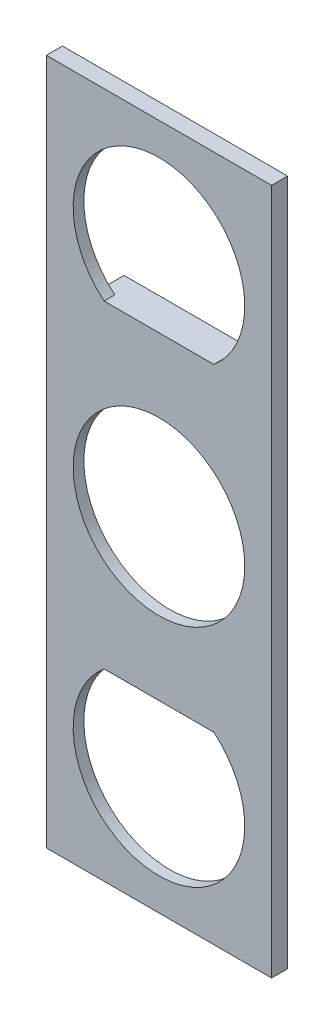
ISO-10303-21;
HEADER;
FILE_DESCRIPTION(('STEP AP214'),'2;1');
FILE_NAME('part.step','',(''),(''),'','','');
FILE_SCHEMA(('AUTOMOTIVE_DESIGN { 1 0 10303 214 1 1 1 1 }'));
ENDSEC;
DATA;
#1=APPLICATION_CONTEXT('core data for automotive mechanical design processes');
#2=APPLICATION_PROTOCOL_DEFINITION('international standard','automotive_design',2000,#1);
#3=PRODUCT_CONTEXT('',#1,'mechanical');
#4=PRODUCT('Part','Part','',(#3));
#5=PRODUCT_RELATED_PRODUCT_CATEGORY('part','',(#4));
#6=PRODUCT_DEFINITION_FORMATION('','',#4);
#7=PRODUCT_DEFINITION_CONTEXT('part definition',#1,'design');
#8=PRODUCT_DEFINITION('design','',#6,#7);
#9=PRODUCT_DEFINITION_SHAPE('','',#8);
#10=(LENGTH_UNIT() NAMED_UNIT(*) SI_UNIT(.MILLI.,.METRE.));
#11=(NAMED_UNIT(*) PLANE_ANGLE_UNIT() SI_UNIT($,.RADIAN.));
#12=(NAMED_UNIT(*) SI_UNIT($,.STERADIAN.) SOLID_ANGLE_UNIT());
#13=UNCERTAINTY_MEASURE_WITH_UNIT(LENGTH_MEASURE(1.E-05),#10,'distance_accuracy_value','');
#14=(GEOMETRIC_REPRESENTATION_CONTEXT(3) GLOBAL_UNCERTAINTY_ASSIGNED_CONTEXT((#13)) GLOBAL_UNIT_ASSIGNED_CONTEXT((#10,
#11,#12)) REPRESENTATION_CONTEXT('',''));
#15=CARTESIAN_POINT('',(0.,0.,0.));
#16=DIRECTION('',(0.,0.,1.));
#17=DIRECTION('',(1.,0.,0.));
#18=AXIS2_PLACEMENT_3D('',#15,#16,#17);
#19=CARTESIAN_POINT('',(-12.4999999999572,29.6984848098497,6.));
#20=DIRECTION('',(1.,0.,0.));
#21=DIRECTION('',(0.,0.,-1.));
#22=AXIS2_PLACEMENT_3D('',#19,#20,#21);
#23=PLANE('',#22);
#24=DIRECTION('',(0.,-1.,0.));
#25=VECTOR('',#24,1.);
#26=CARTESIAN_POINT('',(-12.4999999999572,29.6984848098497,4.));
#27=LINE('',#26,#25);
#28=CARTESIAN_POINT('',(-12.4999999999572,29.6984848098497,4.));
#29=VERTEX_POINT('',#28);
#30=CARTESIAN_POINT('',(-12.4999999999572,24.6984848098497,4.));
#31=VERTEX_POINT('',#30);
#32=EDGE_CURVE('E305',#29,#31,#27,.T.);
#33=ORIENTED_EDGE('',*,*,#32,.F.);
#34=DIRECTION('',(0.,0.,-1.));
#35=VECTOR('',#34,1.);
#36=CARTESIAN_POINT('',(-12.4999999999572,29.6984848098497,6.));
#37=LINE('',#36,#35);
#38=CARTESIAN_POINT('',(-12.4999999999572,29.6984848098497,0.));
#39=VERTEX_POINT('',#38);
#40=EDGE_CURVE('E49',#29,#39,#37,.T.);
#41=ORIENTED_EDGE('',*,*,#40,.T.);
#42=DIRECTION('',(0.,-1.,0.));
#43=VECTOR('',#42,1.);
#44=CARTESIAN_POINT('',(-12.4999999999572,29.6984848098497,0.));
#45=LINE('',#44,#43);
#46=CARTESIAN_POINT('',(-12.4999999999572,24.6984848098497,0.));
#47=VERTEX_POINT('',#46);
#48=EDGE_CURVE('E311',#39,#47,#45,.T.);
#49=ORIENTED_EDGE('',*,*,#48,.T.);
#50=DIRECTION('',(0.,0.,-1.));
#51=VECTOR('',#50,1.);
#52=CARTESIAN_POINT('',(-12.4999999999572,24.6984848098497,6.));
#53=LINE('',#52,#51);
#54=EDGE_CURVE('E326',#31,#47,#53,.T.);
#55=ORIENTED_EDGE('',*,*,#54,.F.);
#56=EDGE_LOOP('',(#33,#41,#49,#55));
#57=FACE_BOUND('',#56,.T.);
#58=ADVANCED_FACE('F35',(#57),#23,.F.);
#59=CARTESIAN_POINT('',(-12.4999999999572,24.6984848098497,6.));
#60=DIRECTION('',(0.,1.,0.));
#61=DIRECTION('',(0.,0.,1.));
#62=AXIS2_PLACEMENT_3D('',#59,#60,#61);
#63=PLANE('',#62);
#64=DIRECTION('',(1.,0.,0.));
#65=VECTOR('',#64,1.);
#66=CARTESIAN_POINT('',(-12.4999999999572,24.6984848098497,4.));
#67=LINE('',#66,#65);
#68=CARTESIAN_POINT('',(12.5000000000427,24.6984848098497,4.));
#69=VERTEX_POINT('',#68);
#70=EDGE_CURVE('E307',#31,#69,#67,.T.);
#71=ORIENTED_EDGE('',*,*,#70,.F.);
#72=ORIENTED_EDGE('',*,*,#54,.T.);
#73=DIRECTION('',(1.,0.,0.));
#74=VECTOR('',#73,1.);
#75=CARTESIAN_POINT('',(-12.4999999999572,24.6984848098497,0.));
#76=LINE('',#75,#74);
#77=CARTESIAN_POINT('',(12.5000000000427,24.6984848098497,0.));
#78=VERTEX_POINT('',#77);
#79=EDGE_CURVE('E317',#47,#78,#76,.T.);
#80=ORIENTED_EDGE('',*,*,#79,.T.);
#81=DIRECTION('',(0.,0.,-1.));
#82=VECTOR('',#81,1.);
#83=CARTESIAN_POINT('',(12.5000000000427,24.6984848098497,6.));
#84=LINE('',#83,#82);
#85=EDGE_CURVE('E325',#69,#78,#84,.T.);
#86=ORIENTED_EDGE('',*,*,#85,.F.);
#87=EDGE_LOOP('',(#71,#72,#80,#86));
#88=FACE_BOUND('',#87,.T.);
#89=ADVANCED_FACE('F344',(#88),#63,.F.);
#90=CARTESIAN_POINT('',(12.5000000000427,29.6984848098497,6.));
#91=DIRECTION('',(-1.,0.,0.));
#92=DIRECTION('',(0.,0.,1.));
#93=AXIS2_PLACEMENT_3D('',#90,#91,#92);
#94=PLANE('',#93);
#95=DIRECTION('',(0.,1.,0.));
#96=VECTOR('',#95,1.);
#97=CARTESIAN_POINT('',(12.5000000000427,29.6984848098497,4.));
#98=LINE('',#97,#96);
#99=CARTESIAN_POINT('',(12.5000000000427,29.6984848098497,4.));
#100=VERTEX_POINT('',#99);
#101=EDGE_CURVE('E309',#69,#100,#98,.T.);
#102=ORIENTED_EDGE('',*,*,#101,.F.);
#103=ORIENTED_EDGE('',*,*,#85,.T.);
#104=DIRECTION('',(0.,1.,0.));
#105=VECTOR('',#104,1.);
#106=CARTESIAN_POINT('',(12.5000000000427,29.6984848098497,0.));
#107=LINE('',#106,#105);
#108=CARTESIAN_POINT('',(12.5000000000427,29.6984848098497,0.));
#109=VERTEX_POINT('',#108);
#110=EDGE_CURVE('E320',#78,#109,#107,.T.);
#111=ORIENTED_EDGE('',*,*,#110,.T.);
#112=DIRECTION('',(0.,0.,-1.));
#113=VECTOR('',#112,1.);
#114=CARTESIAN_POINT('',(12.5000000000427,29.6984848098497,6.));
#115=LINE('',#114,#113);
#116=EDGE_CURVE('E56',#100,#109,#115,.T.);
#117=ORIENTED_EDGE('',*,*,#116,.F.);
#118=EDGE_LOOP('',(#102,#103,#111,#117));
#119=FACE_BOUND('',#118,.T.);
#120=ADVANCED_FACE('F347',(#119),#94,.F.);
#121=CARTESIAN_POINT('',(-12.4999999999572,29.6984848098497,6.));
#122=DIRECTION('',(0.,-1.,0.));
#123=DIRECTION('',(0.,0.,-1.));
#124=AXIS2_PLACEMENT_3D('',#121,#122,#123);
#125=PLANE('',#124);
#126=DIRECTION('',(0.,0.,1.));
#127=VECTOR('',#126,1.);
#128=CARTESIAN_POINT('',(10.2309688703709,29.6984848098497,4.));
#129=LINE('',#128,#127);
#130=CARTESIAN_POINT('',(10.2309688703709,29.6984848098497,4.));
#131=VERTEX_POINT('',#130);
#132=CARTESIAN_POINT('',(10.2309688703709,29.6984848098497,6.));
#133=VERTEX_POINT('',#132);
#134=EDGE_CURVE('E303',#131,#133,#129,.T.);
#135=ORIENTED_EDGE('',*,*,#134,.F.);
#136=DIRECTION('',(-1.,0.,0.));
#137=VECTOR('',#136,1.);
#138=CARTESIAN_POINT('',(-12.4999999999572,29.6984848098497,4.));
#139=LINE('',#138,#137);
#140=EDGE_CURVE('E11',#100,#131,#139,.T.);
#141=ORIENTED_EDGE('',*,*,#140,.F.);
#142=ORIENTED_EDGE('',*,*,#116,.T.);
#143=DIRECTION('',(-1.,0.,0.));
#144=VECTOR('',#143,1.);
#145=CARTESIAN_POINT('',(-12.4999999999572,29.6984848098497,0.));
#146=LINE('',#145,#144);
#147=EDGE_CURVE('E315',#109,#39,#146,.T.);
#148=ORIENTED_EDGE('',*,*,#147,.T.);
#149=ORIENTED_EDGE('',*,*,#40,.F.);
#150=CARTESIAN_POINT('',(-10.2309688703712,29.6984848098497,4.));
#151=VERTEX_POINT('',#150);
#152=EDGE_CURVE('E38',#151,#29,#139,.T.);
#153=ORIENTED_EDGE('',*,*,#152,.F.);
#154=DIRECTION('',(0.,0.,1.));
#155=VECTOR('',#154,1.);
#156=CARTESIAN_POINT('',(-10.2309688703712,29.6984848098497,4.));
#157=LINE('',#156,#155);
#158=CARTESIAN_POINT('',(-10.2309688703712,29.6984848098497,6.));
#159=VERTEX_POINT('',#158);
#160=EDGE_CURVE('E299',#159,#151,#157,.F.);
#161=ORIENTED_EDGE('',*,*,#160,.F.);
#162=DIRECTION('',(-1.,0.,0.));
#163=VECTOR('',#162,1.);
#164=CARTESIAN_POINT('',(-12.4999999999572,29.6984848098497,6.));
#165=LINE('',#164,#163);
#166=EDGE_CURVE('E312',#133,#159,#165,.T.);
#167=ORIENTED_EDGE('',*,*,#166,.F.);
#168=EDGE_LOOP('',(#135,#141,#142,#148,#149,#153,#161,#167));
#169=FACE_BOUND('',#168,.T.);
#170=ADVANCED_FACE('F337',(#169),#125,.F.);
#171=CARTESIAN_POINT('',(0.,0.,6.));
#172=DIRECTION('',(0.,0.,1.));
#173=DIRECTION('',(1.,0.,0.));
#174=AXIS2_PLACEMENT_3D('',#171,#172,#173);
#175=PLANE('',#174);
#176=CARTESIAN_POINT('',(-1.47451495458029E-13,42.,6.));
#177=DIRECTION('',(0.,0.,1.));
#178=DIRECTION('',(1.,0.,0.));
#179=AXIS2_PLACEMENT_3D('',#176,#177,#178);
#180=CIRCLE('',#179,16.);
#181=EDGE_CURVE('E261',#133,#159,#180,.T.);
#182=ORIENTED_EDGE('',*,*,#181,.F.);
#183=ORIENTED_EDGE('',*,*,#166,.T.);
#184=EDGE_LOOP('',(#182,#183));
#185=FACE_BOUND('',#184,.T.);
#186=CARTESIAN_POINT('',(0.,0.,6.));
#187=DIRECTION('',(0.,0.,1.));
#188=DIRECTION('',(1.,0.,0.));
#189=AXIS2_PLACEMENT_3D('',#186,#187,#188);
#190=CIRCLE('',#189,16.);
#191=CARTESIAN_POINT('',(16.,0.,6.));
#192=VERTEX_POINT('',#191);
#193=EDGE_CURVE('E266',#192,#192,#190,.T.);
#194=ORIENTED_EDGE('',*,*,#193,.F.);
#195=EDGE_LOOP('',(#194));
#196=FACE_BOUND('',#195,.T.);
#197=CARTESIAN_POINT('',(4.40619762898109E-13,-42.,6.));
#198=DIRECTION('',(0.,0.,1.));
#199=DIRECTION('',(1.,0.,0.));
#200=AXIS2_PLACEMENT_3D('',#197,#198,#199);
#201=CIRCLE('',#200,16.);
#202=CARTESIAN_POINT('',(-10.2309688702872,-29.6984848097803,6.));
#203=VERTEX_POINT('',#202);
#204=CARTESIAN_POINT('',(10.2309688702881,-29.6984848097803,6.));
#205=VERTEX_POINT('',#204);
#206=EDGE_CURVE('E292',#203,#205,#201,.T.);
#207=ORIENTED_EDGE('',*,*,#206,.F.);
#208=DIRECTION('',(1.,0.,0.));
#209=VECTOR('',#208,1.);
#210=CARTESIAN_POINT('',(-12.4999999999536,-29.6984848097803,6.));
#211=LINE('',#210,#209);
#212=EDGE_CURVE('E239',#203,#205,#211,.T.);
#213=ORIENTED_EDGE('',*,*,#212,.T.);
#214=EDGE_LOOP('',(#207,#213));
#215=FACE_BOUND('',#214,.T.);
#216=DIRECTION('',(0.,-1.,0.));
#217=VECTOR('',#216,1.);
#218=CARTESIAN_POINT('',(20.9999999999999,0.,6.));
#219=LINE('',#218,#217);
#220=CARTESIAN_POINT('',(20.9999999999999,64.,6.));
#221=VERTEX_POINT('',#220);
#222=CARTESIAN_POINT('',(20.9999999999999,-64.,6.));
#223=VERTEX_POINT('',#222);
#224=EDGE_CURVE('E218',#221,#223,#219,.T.);
#225=ORIENTED_EDGE('',*,*,#224,.F.);
#226=DIRECTION('',(1.,0.,0.));
#227=VECTOR('',#226,1.);
#228=CARTESIAN_POINT('',(0.,64.,6.));
#229=LINE('',#228,#227);
#230=CARTESIAN_POINT('',(-21.0000000000001,64.,6.));
#231=VERTEX_POINT('',#230);
#232=EDGE_CURVE('E189',#231,#221,#229,.T.);
#233=ORIENTED_EDGE('',*,*,#232,.F.);
#234=DIRECTION('',(0.,-1.,0.));
#235=VECTOR('',#234,1.);
#236=CARTESIAN_POINT('',(-21.0000000000001,0.,6.));
#237=LINE('',#236,#235);
#238=CARTESIAN_POINT('',(-21.0000000000001,-64.,6.));
#239=VERTEX_POINT('',#238);
#240=EDGE_CURVE('E202',#231,#239,#237,.T.);
#241=ORIENTED_EDGE('',*,*,#240,.T.);
#242=DIRECTION('',(1.,0.,0.));
#243=VECTOR('',#242,1.);
#244=CARTESIAN_POINT('',(0.,-64.,6.));
#245=LINE('',#244,#243);
#246=EDGE_CURVE('E199',#239,#223,#245,.T.);
#247=ORIENTED_EDGE('',*,*,#246,.T.);
#248=EDGE_LOOP('',(#225,#233,#241,#247));
#249=FACE_BOUND('',#248,.T.);
#250=ADVANCED_FACE('F353',(#185,#196,#215,#249),#175,.T.);
#251=CARTESIAN_POINT('',(0.,0.,0.));
#252=DIRECTION('',(0.,0.,1.));
#253=DIRECTION('',(1.,0.,0.));
#254=AXIS2_PLACEMENT_3D('',#251,#252,#253);
#255=PLANE('',#254);
#256=ORIENTED_EDGE('',*,*,#48,.F.);
#257=ORIENTED_EDGE('',*,*,#147,.F.);
#258=ORIENTED_EDGE('',*,*,#110,.F.);
#259=ORIENTED_EDGE('',*,*,#79,.F.);
#260=EDGE_LOOP('',(#256,#257,#258,#259));
#261=FACE_BOUND('',#260,.T.);
#262=ADVANCED_FACE('F342',(#261),#255,.F.);
#263=CARTESIAN_POINT('',(0.,0.,4.));
#264=DIRECTION('',(0.,0.,1.));
#265=DIRECTION('',(1.,0.,0.));
#266=AXIS2_PLACEMENT_3D('',#263,#264,#265);
#267=PLANE('',#266);
#268=CARTESIAN_POINT('',(4.40619762898109E-13,-42.,4.));
#269=DIRECTION('',(0.,0.,1.));
#270=DIRECTION('',(1.,0.,0.));
#271=AXIS2_PLACEMENT_3D('',#268,#269,#270);
#272=CIRCLE('',#271,16.);
#273=CARTESIAN_POINT('',(-10.2309688702872,-29.6984848097803,4.));
#274=VERTEX_POINT('',#273);
#275=CARTESIAN_POINT('',(10.2309688702881,-29.6984848097803,4.));
#276=VERTEX_POINT('',#275);
#277=EDGE_CURVE('E265',#274,#276,#272,.T.);
#278=ORIENTED_EDGE('',*,*,#277,.T.);
#279=DIRECTION('',(1.,0.,0.));
#280=VECTOR('',#279,1.);
#281=CARTESIAN_POINT('',(0.,-29.6984848097803,4.));
#282=LINE('',#281,#280);
#283=CARTESIAN_POINT('',(12.5000000000463,-29.6984848097803,4.));
#284=VERTEX_POINT('',#283);
#285=EDGE_CURVE('E271',#276,#284,#282,.T.);
#286=ORIENTED_EDGE('',*,*,#285,.T.);
#287=DIRECTION('',(0.,1.,0.));
#288=VECTOR('',#287,1.);
#289=CARTESIAN_POINT('',(12.5000000000463,0.,4.));
#290=LINE('',#289,#288);
#291=CARTESIAN_POINT('',(12.5000000000463,-24.6984848097803,4.));
#292=VERTEX_POINT('',#291);
#293=EDGE_CURVE('E275',#284,#292,#290,.T.);
#294=ORIENTED_EDGE('',*,*,#293,.T.);
#295=DIRECTION('',(-1.,0.,0.));
#296=VECTOR('',#295,1.);
#297=CARTESIAN_POINT('',(0.,-24.6984848097803,4.));
#298=LINE('',#297,#296);
#299=CARTESIAN_POINT('',(-12.4999999999536,-24.6984848097803,4.));
#300=VERTEX_POINT('',#299);
#301=EDGE_CURVE('E273',#292,#300,#298,.T.);
#302=ORIENTED_EDGE('',*,*,#301,.T.);
#303=DIRECTION('',(0.,-1.,0.));
#304=VECTOR('',#303,1.);
#305=CARTESIAN_POINT('',(-12.4999999999536,0.,4.));
#306=LINE('',#305,#304);
#307=CARTESIAN_POINT('',(-12.4999999999536,-29.6984848097803,4.));
#308=VERTEX_POINT('',#307);
#309=EDGE_CURVE('E270',#300,#308,#306,.T.);
#310=ORIENTED_EDGE('',*,*,#309,.T.);
#311=EDGE_CURVE('E268',#308,#274,#282,.T.);
#312=ORIENTED_EDGE('',*,*,#311,.T.);
#313=EDGE_LOOP('',(#278,#286,#294,#302,#310,#312));
#314=FACE_BOUND('',#313,.T.);
#315=CARTESIAN_POINT('',(0.,0.,4.));
#316=DIRECTION('',(0.,0.,1.));
#317=DIRECTION('',(1.,0.,0.));
#318=AXIS2_PLACEMENT_3D('',#315,#316,#317);
#319=CIRCLE('',#318,16.);
#320=CARTESIAN_POINT('',(16.,0.,4.));
#321=VERTEX_POINT('',#320);
#322=EDGE_CURVE('E277',#321,#321,#319,.T.);
#323=ORIENTED_EDGE('',*,*,#322,.T.);
#324=EDGE_LOOP('',(#323));
#325=FACE_BOUND('',#324,.T.);
#326=DIRECTION('',(1.,0.,0.));
#327=VECTOR('',#326,1.);
#328=CARTESIAN_POINT('',(0.,60.,4.));
#329=LINE('',#328,#327);
#330=CARTESIAN_POINT('',(-17.0000000000001,60.,4.));
#331=VERTEX_POINT('',#330);
#332=CARTESIAN_POINT('',(16.9999999999999,60.,4.));
#333=VERTEX_POINT('',#332);
#334=EDGE_CURVE('E280',#331,#333,#329,.T.);
#335=ORIENTED_EDGE('',*,*,#334,.T.);
#336=DIRECTION('',(0.,-1.,0.));
#337=VECTOR('',#336,1.);
#338=CARTESIAN_POINT('',(16.9999999999999,0.,4.));
#339=LINE('',#338,#337);
#340=CARTESIAN_POINT('',(16.9999999999999,-60.,4.));
#341=VERTEX_POINT('',#340);
#342=EDGE_CURVE('E287',#333,#341,#339,.T.);
#343=ORIENTED_EDGE('',*,*,#342,.T.);
#344=DIRECTION('',(1.,0.,0.));
#345=VECTOR('',#344,1.);
#346=CARTESIAN_POINT('',(0.,-60.,4.));
#347=LINE('',#346,#345);
#348=CARTESIAN_POINT('',(-17.0000000000001,-60.,4.));
#349=VERTEX_POINT('',#348);
#350=EDGE_CURVE('E285',#349,#341,#347,.T.);
#351=ORIENTED_EDGE('',*,*,#350,.F.);
#352=DIRECTION('',(0.,-1.,0.));
#353=VECTOR('',#352,1.);
#354=CARTESIAN_POINT('',(-17.0000000000001,0.,4.));
#355=LINE('',#354,#353);
#356=EDGE_CURVE('E283',#331,#349,#355,.T.);
#357=ORIENTED_EDGE('',*,*,#356,.F.);
#358=EDGE_LOOP('',(#335,#343,#351,#357));
#359=FACE_BOUND('',#358,.T.);
#360=ORIENTED_EDGE('',*,*,#101,.T.);
#361=ORIENTED_EDGE('',*,*,#140,.T.);
#362=CARTESIAN_POINT('',(-1.47451495458029E-13,42.,4.));
#363=DIRECTION('',(0.,0.,1.));
#364=DIRECTION('',(1.,0.,0.));
#365=AXIS2_PLACEMENT_3D('',#362,#363,#364);
#366=CIRCLE('',#365,16.);
#367=EDGE_CURVE('E262',#131,#151,#366,.T.);
#368=ORIENTED_EDGE('',*,*,#367,.T.);
#369=ORIENTED_EDGE('',*,*,#152,.T.);
#370=ORIENTED_EDGE('',*,*,#32,.T.);
#371=ORIENTED_EDGE('',*,*,#70,.T.);
#372=EDGE_LOOP('',(#360,#361,#368,#369,#370,#371));
#373=FACE_BOUND('',#372,.T.);
#374=ADVANCED_FACE('F333',(#314,#325,#359,#373),#267,.F.);
#375=CARTESIAN_POINT('',(-1.47451495458029E-13,42.,4.));
#376=DIRECTION('',(0.,0.,1.));
#377=DIRECTION('',(1.,0.,0.));
#378=AXIS2_PLACEMENT_3D('',#375,#376,#377);
#379=CYLINDRICAL_SURFACE('',#378,16.);
#380=ORIENTED_EDGE('',*,*,#367,.F.);
#381=ORIENTED_EDGE('',*,*,#134,.T.);
#382=ORIENTED_EDGE('',*,*,#181,.T.);
#383=ORIENTED_EDGE('',*,*,#160,.T.);
#384=EDGE_LOOP('',(#380,#381,#382,#383));
#385=FACE_BOUND('',#384,.T.);
#386=ADVANCED_FACE('F351',(#385),#379,.F.);
#387=CARTESIAN_POINT('',(4.40619762898109E-13,-42.,4.));
#388=DIRECTION('',(0.,0.,1.));
#389=DIRECTION('',(1.,0.,0.));
#390=AXIS2_PLACEMENT_3D('',#387,#388,#389);
#391=CYLINDRICAL_SURFACE('',#390,16.);
#392=ORIENTED_EDGE('',*,*,#206,.T.);
#393=DIRECTION('',(0.,0.,1.));
#394=VECTOR('',#393,1.);
#395=CARTESIAN_POINT('',(10.2309688702881,-29.6984848097803,4.));
#396=LINE('',#395,#394);
#397=EDGE_CURVE('E296',#276,#205,#396,.T.);
#398=ORIENTED_EDGE('',*,*,#397,.F.);
#399=ORIENTED_EDGE('',*,*,#277,.F.);
#400=DIRECTION('',(0.,0.,1.));
#401=VECTOR('',#400,1.);
#402=CARTESIAN_POINT('',(-10.2309688702872,-29.6984848097803,4.));
#403=LINE('',#402,#401);
#404=EDGE_CURVE('E290',#274,#203,#403,.T.);
#405=ORIENTED_EDGE('',*,*,#404,.T.);
#406=EDGE_LOOP('',(#392,#398,#399,#405));
#407=FACE_BOUND('',#406,.T.);
#408=ADVANCED_FACE('F389',(#407),#391,.F.);
#409=CARTESIAN_POINT('',(0.,0.,4.));
#410=DIRECTION('',(0.,0.,1.));
#411=DIRECTION('',(1.,0.,0.));
#412=AXIS2_PLACEMENT_3D('',#409,#410,#411);
#413=CYLINDRICAL_SURFACE('',#412,16.);
#414=ORIENTED_EDGE('',*,*,#322,.F.);
#415=EDGE_LOOP('',(#414));
#416=FACE_BOUND('',#415,.T.);
#417=ORIENTED_EDGE('',*,*,#193,.T.);
#418=EDGE_LOOP('',(#417));
#419=FACE_BOUND('',#418,.T.);
#420=ADVANCED_FACE('F392',(#416,#419),#413,.F.);
#421=CARTESIAN_POINT('',(12.5000000000463,-24.6984848097803,6.));
#422=DIRECTION('',(-1.,0.,0.));
#423=DIRECTION('',(0.,0.,1.));
#424=AXIS2_PLACEMENT_3D('',#421,#422,#423);
#425=PLANE('',#424);
#426=DIRECTION('',(0.,0.,-1.));
#427=VECTOR('',#426,1.);
#428=CARTESIAN_POINT('',(12.5000000000463,-24.6984848097803,6.));
#429=LINE('',#428,#427);
#430=CARTESIAN_POINT('',(12.5000000000463,-24.6984848097803,0.));
#431=VERTEX_POINT('',#430);
#432=EDGE_CURVE('E242',#292,#431,#429,.T.);
#433=ORIENTED_EDGE('',*,*,#432,.F.);
#434=ORIENTED_EDGE('',*,*,#293,.F.);
#435=DIRECTION('',(0.,0.,-1.));
#436=VECTOR('',#435,1.);
#437=CARTESIAN_POINT('',(12.5000000000463,-29.6984848097803,6.));
#438=LINE('',#437,#436);
#439=CARTESIAN_POINT('',(12.5000000000463,-29.6984848097803,0.));
#440=VERTEX_POINT('',#439);
#441=EDGE_CURVE('E255',#284,#440,#438,.T.);
#442=ORIENTED_EDGE('',*,*,#441,.T.);
#443=DIRECTION('',(0.,1.,0.));
#444=VECTOR('',#443,1.);
#445=CARTESIAN_POINT('',(12.5000000000463,-24.6984848097803,0.));
#446=LINE('',#445,#444);
#447=EDGE_CURVE('E243',#440,#431,#446,.T.);
#448=ORIENTED_EDGE('',*,*,#447,.T.);
#449=EDGE_LOOP('',(#433,#434,#442,#448));
#450=FACE_BOUND('',#449,.T.);
#451=ADVANCED_FACE('F396',(#450),#425,.F.);
#452=CARTESIAN_POINT('',(-12.4999999999536,-24.6984848097803,6.));
#453=DIRECTION('',(0.,-1.,0.));
#454=DIRECTION('',(0.,0.,-1.));
#455=AXIS2_PLACEMENT_3D('',#452,#453,#454);
#456=PLANE('',#455);
#457=DIRECTION('',(0.,0.,-1.));
#458=VECTOR('',#457,1.);
#459=CARTESIAN_POINT('',(-12.4999999999536,-24.6984848097803,6.));
#460=LINE('',#459,#458);
#461=CARTESIAN_POINT('',(-12.4999999999536,-24.6984848097803,0.));
#462=VERTEX_POINT('',#461);
#463=EDGE_CURVE('E259',#300,#462,#460,.T.);
#464=ORIENTED_EDGE('',*,*,#463,.F.);
#465=ORIENTED_EDGE('',*,*,#301,.F.);
#466=ORIENTED_EDGE('',*,*,#432,.T.);
#467=DIRECTION('',(-1.,0.,0.));
#468=VECTOR('',#467,1.);
#469=CARTESIAN_POINT('',(-12.4999999999536,-24.6984848097803,0.));
#470=LINE('',#469,#468);
#471=EDGE_CURVE('E226',#431,#462,#470,.T.);
#472=ORIENTED_EDGE('',*,*,#471,.T.);
#473=EDGE_LOOP('',(#464,#465,#466,#472));
#474=FACE_BOUND('',#473,.T.);
#475=ADVANCED_FACE('F401',(#474),#456,.F.);
#476=CARTESIAN_POINT('',(-12.4999999999536,-29.6984848097803,6.));
#477=DIRECTION('',(0.,1.,0.));
#478=DIRECTION('',(0.,0.,1.));
#479=AXIS2_PLACEMENT_3D('',#476,#477,#478);
#480=PLANE('',#479);
#481=ORIENTED_EDGE('',*,*,#404,.F.);
#482=ORIENTED_EDGE('',*,*,#311,.F.);
#483=DIRECTION('',(0.,0.,-1.));
#484=VECTOR('',#483,1.);
#485=CARTESIAN_POINT('',(-12.4999999999536,-29.6984848097803,6.));
#486=LINE('',#485,#484);
#487=CARTESIAN_POINT('',(-12.4999999999536,-29.6984848097803,0.));
#488=VERTEX_POINT('',#487);
#489=EDGE_CURVE('E257',#308,#488,#486,.T.);
#490=ORIENTED_EDGE('',*,*,#489,.T.);
#491=DIRECTION('',(1.,0.,0.));
#492=VECTOR('',#491,1.);
#493=CARTESIAN_POINT('',(-12.4999999999536,-29.6984848097803,0.));
#494=LINE('',#493,#492);
#495=EDGE_CURVE('E249',#488,#440,#494,.T.);
#496=ORIENTED_EDGE('',*,*,#495,.T.);
#497=ORIENTED_EDGE('',*,*,#441,.F.);
#498=ORIENTED_EDGE('',*,*,#285,.F.);
#499=ORIENTED_EDGE('',*,*,#397,.T.);
#500=ORIENTED_EDGE('',*,*,#212,.F.);
#501=EDGE_LOOP('',(#481,#482,#490,#496,#497,#498,#499,#500));
#502=FACE_BOUND('',#501,.T.);
#503=ADVANCED_FACE('F404',(#502),#480,.F.);
#504=CARTESIAN_POINT('',(-12.4999999999536,-24.6984848097803,6.));
#505=DIRECTION('',(1.,0.,0.));
#506=DIRECTION('',(0.,0.,-1.));
#507=AXIS2_PLACEMENT_3D('',#504,#505,#506);
#508=PLANE('',#507);
#509=ORIENTED_EDGE('',*,*,#489,.F.);
#510=ORIENTED_EDGE('',*,*,#309,.F.);
#511=ORIENTED_EDGE('',*,*,#463,.T.);
#512=DIRECTION('',(0.,-1.,0.));
#513=VECTOR('',#512,1.);
#514=CARTESIAN_POINT('',(-12.4999999999536,-24.6984848097803,0.));
#515=LINE('',#514,#513);
#516=EDGE_CURVE('E246',#462,#488,#515,.T.);
#517=ORIENTED_EDGE('',*,*,#516,.T.);
#518=EDGE_LOOP('',(#509,#510,#511,#517));
#519=FACE_BOUND('',#518,.T.);
#520=ADVANCED_FACE('F406',(#519),#508,.F.);
#521=CARTESIAN_POINT('',(0.,0.,0.));
#522=DIRECTION('',(0.,0.,-1.));
#523=DIRECTION('',(-1.,0.,0.));
#524=AXIS2_PLACEMENT_3D('',#521,#522,#523);
#525=PLANE('',#524);
#526=ORIENTED_EDGE('',*,*,#471,.F.);
#527=ORIENTED_EDGE('',*,*,#447,.F.);
#528=ORIENTED_EDGE('',*,*,#495,.F.);
#529=ORIENTED_EDGE('',*,*,#516,.F.);
#530=EDGE_LOOP('',(#526,#527,#528,#529));
#531=FACE_BOUND('',#530,.T.);
#532=ADVANCED_FACE('F409',(#531),#525,.T.);
#533=CARTESIAN_POINT('',(-17.0000000000001,0.,3.));
#534=DIRECTION('',(-1.,0.,0.));
#535=DIRECTION('',(0.,-1.,0.));
#536=AXIS2_PLACEMENT_3D('',#533,#534,#535);
#537=PLANE('',#536);
#538=DIRECTION('',(0.,0.,1.));
#539=VECTOR('',#538,1.);
#540=CARTESIAN_POINT('',(-17.0000000000001,60.,3.));
#541=LINE('',#540,#539);
#542=CARTESIAN_POINT('',(-17.0000000000001,60.,3.));
#543=VERTEX_POINT('',#542);
#544=EDGE_CURVE('E232',#543,#331,#541,.T.);
#545=ORIENTED_EDGE('',*,*,#544,.T.);
#546=ORIENTED_EDGE('',*,*,#356,.T.);
#547=DIRECTION('',(0.,0.,1.));
#548=VECTOR('',#547,1.);
#549=CARTESIAN_POINT('',(-17.0000000000001,-60.,3.));
#550=LINE('',#549,#548);
#551=CARTESIAN_POINT('',(-17.0000000000001,-60.,3.));
#552=VERTEX_POINT('',#551);
#553=EDGE_CURVE('E223',#552,#349,#550,.T.);
#554=ORIENTED_EDGE('',*,*,#553,.F.);
#555=DIRECTION('',(0.,-1.,0.));
#556=VECTOR('',#555,1.);
#557=CARTESIAN_POINT('',(-17.0000000000001,0.,3.));
#558=LINE('',#557,#556);
#559=EDGE_CURVE('E208',#543,#552,#558,.T.);
#560=ORIENTED_EDGE('',*,*,#559,.F.);
#561=EDGE_LOOP('',(#545,#546,#554,#560));
#562=FACE_BOUND('',#561,.T.);
#563=ADVANCED_FACE('F419',(#562),#537,.F.);
#564=CARTESIAN_POINT('',(16.9999999999999,0.,3.));
#565=DIRECTION('',(-1.,0.,0.));
#566=DIRECTION('',(0.,-1.,0.));
#567=AXIS2_PLACEMENT_3D('',#564,#565,#566);
#568=PLANE('',#567);
#569=ORIENTED_EDGE('',*,*,#342,.F.);
#570=DIRECTION('',(0.,0.,1.));
#571=VECTOR('',#570,1.);
#572=CARTESIAN_POINT('',(16.9999999999999,60.,3.));
#573=LINE('',#572,#571);
#574=CARTESIAN_POINT('',(16.9999999999999,60.,3.));
#575=VERTEX_POINT('',#574);
#576=EDGE_CURVE('E230',#575,#333,#573,.T.);
#577=ORIENTED_EDGE('',*,*,#576,.F.);
#578=DIRECTION('',(0.,-1.,0.));
#579=VECTOR('',#578,1.);
#580=CARTESIAN_POINT('',(16.9999999999999,0.,3.));
#581=LINE('',#580,#579);
#582=CARTESIAN_POINT('',(16.9999999999999,-60.,3.));
#583=VERTEX_POINT('',#582);
#584=EDGE_CURVE('E214',#575,#583,#581,.T.);
#585=ORIENTED_EDGE('',*,*,#584,.T.);
#586=DIRECTION('',(0.,0.,1.));
#587=VECTOR('',#586,1.);
#588=CARTESIAN_POINT('',(16.9999999999999,-60.,3.));
#589=LINE('',#588,#587);
#590=EDGE_CURVE('E227',#583,#341,#589,.T.);
#591=ORIENTED_EDGE('',*,*,#590,.T.);
#592=EDGE_LOOP('',(#569,#577,#585,#591));
#593=FACE_BOUND('',#592,.T.);
#594=ADVANCED_FACE('F432',(#593),#568,.T.);
#595=CARTESIAN_POINT('',(0.,-60.,3.));
#596=DIRECTION('',(0.,-1.,0.));
#597=DIRECTION('',(0.,0.,-1.));
#598=AXIS2_PLACEMENT_3D('',#595,#596,#597);
#599=PLANE('',#598);
#600=ORIENTED_EDGE('',*,*,#553,.T.);
#601=ORIENTED_EDGE('',*,*,#350,.T.);
#602=ORIENTED_EDGE('',*,*,#590,.F.);
#603=DIRECTION('',(1.,0.,0.));
#604=VECTOR('',#603,1.);
#605=CARTESIAN_POINT('',(0.,-60.,3.));
#606=LINE('',#605,#604);
#607=EDGE_CURVE('E194',#552,#583,#606,.T.);
#608=ORIENTED_EDGE('',*,*,#607,.F.);
#609=EDGE_LOOP('',(#600,#601,#602,#608));
#610=FACE_BOUND('',#609,.T.);
#611=ADVANCED_FACE('F426',(#610),#599,.F.);
#612=CARTESIAN_POINT('',(0.,60.,3.));
#613=DIRECTION('',(0.,-1.,0.));
#614=DIRECTION('',(0.,0.,-1.));
#615=AXIS2_PLACEMENT_3D('',#612,#613,#614);
#616=PLANE('',#615);
#617=ORIENTED_EDGE('',*,*,#334,.F.);
#618=ORIENTED_EDGE('',*,*,#544,.F.);
#619=DIRECTION('',(1.,0.,0.));
#620=VECTOR('',#619,1.);
#621=CARTESIAN_POINT('',(0.,60.,3.));
#622=LINE('',#621,#620);
#623=EDGE_CURVE('E211',#543,#575,#622,.T.);
#624=ORIENTED_EDGE('',*,*,#623,.T.);
#625=ORIENTED_EDGE('',*,*,#576,.T.);
#626=EDGE_LOOP('',(#617,#618,#624,#625));
#627=FACE_BOUND('',#626,.T.);
#628=ADVANCED_FACE('F422',(#627),#616,.T.);
#629=CARTESIAN_POINT('',(20.9999999999999,0.,3.));
#630=DIRECTION('',(-1.,0.,0.));
#631=DIRECTION('',(0.,-1.,0.));
#632=AXIS2_PLACEMENT_3D('',#629,#630,#631);
#633=PLANE('',#632);
#634=ORIENTED_EDGE('',*,*,#224,.T.);
#635=DIRECTION('',(0.,0.,1.));
#636=VECTOR('',#635,1.);
#637=CARTESIAN_POINT('',(20.9999999999999,-64.,3.));
#638=LINE('',#637,#636);
#639=CARTESIAN_POINT('',(20.9999999999999,-64.,3.));
#640=VERTEX_POINT('',#639);
#641=EDGE_CURVE('E197',#640,#223,#638,.T.);
#642=ORIENTED_EDGE('',*,*,#641,.F.);
#643=DIRECTION('',(0.,-1.,0.));
#644=VECTOR('',#643,1.);
#645=CARTESIAN_POINT('',(20.9999999999999,0.,3.));
#646=LINE('',#645,#644);
#647=CARTESIAN_POINT('',(20.9999999999999,64.,3.));
#648=VERTEX_POINT('',#647);
#649=EDGE_CURVE('E179',#648,#640,#646,.T.);
#650=ORIENTED_EDGE('',*,*,#649,.F.);
#651=DIRECTION('',(0.,0.,1.));
#652=VECTOR('',#651,1.);
#653=CARTESIAN_POINT('',(20.9999999999999,64.,3.));
#654=LINE('',#653,#652);
#655=EDGE_CURVE('E186',#648,#221,#654,.T.);
#656=ORIENTED_EDGE('',*,*,#655,.T.);
#657=EDGE_LOOP('',(#634,#642,#650,#656));
#658=FACE_BOUND('',#657,.T.);
#659=ADVANCED_FACE('F196',(#658),#633,.F.);
#660=CARTESIAN_POINT('',(0.,-64.,3.));
#661=DIRECTION('',(0.,-1.,0.));
#662=DIRECTION('',(0.,0.,-1.));
#663=AXIS2_PLACEMENT_3D('',#660,#661,#662);
#664=PLANE('',#663);
#665=ORIENTED_EDGE('',*,*,#246,.F.);
#666=DIRECTION('',(0.,0.,1.));
#667=VECTOR('',#666,1.);
#668=CARTESIAN_POINT('',(-21.0000000000001,-64.,3.));
#669=LINE('',#668,#667);
#670=CARTESIAN_POINT('',(-21.0000000000001,-64.,3.));
#671=VERTEX_POINT('',#670);
#672=EDGE_CURVE('E236',#671,#239,#669,.T.);
#673=ORIENTED_EDGE('',*,*,#672,.F.);
#674=DIRECTION('',(1.,0.,0.));
#675=VECTOR('',#674,1.);
#676=CARTESIAN_POINT('',(0.,-64.,3.));
#677=LINE('',#676,#675);
#678=EDGE_CURVE('E206',#671,#640,#677,.T.);
#679=ORIENTED_EDGE('',*,*,#678,.T.);
#680=ORIENTED_EDGE('',*,*,#641,.T.);
#681=EDGE_LOOP('',(#665,#673,#679,#680));
#682=FACE_BOUND('',#681,.T.);
#683=ADVANCED_FACE('F363',(#682),#664,.T.);
#684=CARTESIAN_POINT('',(-21.0000000000001,0.,3.));
#685=DIRECTION('',(-1.,0.,0.));
#686=DIRECTION('',(0.,-1.,0.));
#687=AXIS2_PLACEMENT_3D('',#684,#685,#686);
#688=PLANE('',#687);
#689=ORIENTED_EDGE('',*,*,#240,.F.);
#690=DIRECTION('',(0.,0.,1.));
#691=VECTOR('',#690,1.);
#692=CARTESIAN_POINT('',(-21.0000000000001,64.,3.));
#693=LINE('',#692,#691);
#694=CARTESIAN_POINT('',(-21.0000000000001,64.,3.));
#695=VERTEX_POINT('',#694);
#696=EDGE_CURVE('E193',#695,#231,#693,.T.);
#697=ORIENTED_EDGE('',*,*,#696,.F.);
#698=DIRECTION('',(0.,-1.,0.));
#699=VECTOR('',#698,1.);
#700=CARTESIAN_POINT('',(-21.0000000000001,0.,3.));
#701=LINE('',#700,#699);
#702=EDGE_CURVE('E182',#695,#671,#701,.T.);
#703=ORIENTED_EDGE('',*,*,#702,.T.);
#704=ORIENTED_EDGE('',*,*,#672,.T.);
#705=EDGE_LOOP('',(#689,#697,#703,#704));
#706=FACE_BOUND('',#705,.T.);
#707=ADVANCED_FACE('F365',(#706),#688,.T.);
#708=CARTESIAN_POINT('',(0.,64.,3.));
#709=DIRECTION('',(0.,-1.,0.));
#710=DIRECTION('',(0.,0.,-1.));
#711=AXIS2_PLACEMENT_3D('',#708,#709,#710);
#712=PLANE('',#711);
#713=ORIENTED_EDGE('',*,*,#232,.T.);
#714=ORIENTED_EDGE('',*,*,#655,.F.);
#715=DIRECTION('',(1.,0.,0.));
#716=VECTOR('',#715,1.);
#717=CARTESIAN_POINT('',(0.,64.,3.));
#718=LINE('',#717,#716);
#719=EDGE_CURVE('E173',#695,#648,#718,.T.);
#720=ORIENTED_EDGE('',*,*,#719,.F.);
#721=ORIENTED_EDGE('',*,*,#696,.T.);
#722=EDGE_LOOP('',(#713,#714,#720,#721));
#723=FACE_BOUND('',#722,.T.);
#724=ADVANCED_FACE('F187',(#723),#712,.F.);
#725=CARTESIAN_POINT('',(0.,0.,3.));
#726=DIRECTION('',(0.,0.,1.));
#727=DIRECTION('',(1.,0.,0.));
#728=AXIS2_PLACEMENT_3D('',#725,#726,#727);
#729=PLANE('',#728);
#730=ORIENTED_EDGE('',*,*,#649,.T.);
#731=ORIENTED_EDGE('',*,*,#678,.F.);
#732=ORIENTED_EDGE('',*,*,#702,.F.);
#733=ORIENTED_EDGE('',*,*,#719,.T.);
#734=EDGE_LOOP('',(#730,#731,#732,#733));
#735=FACE_BOUND('',#734,.T.);
#736=ORIENTED_EDGE('',*,*,#559,.T.);
#737=ORIENTED_EDGE('',*,*,#607,.T.);
#738=ORIENTED_EDGE('',*,*,#584,.F.);
#739=ORIENTED_EDGE('',*,*,#623,.F.);
#740=EDGE_LOOP('',(#736,#737,#738,#739));
#741=FACE_BOUND('',#740,.T.);
#742=ADVANCED_FACE('F175',(#735,#741),#729,.F.);
#743=CLOSED_SHELL('',(#58,#89,#120,#170,#250,#262,#374,#386,#408,#420,#451,#475,#503,#520,#532,
#563,#594,#611,#628,#659,#683,#707,#724,#742));
#744=MANIFOLD_SOLID_BREP('B2',#743);
#745=ADVANCED_BREP_SHAPE_REPRESENTATION('',(#18,#744),#14);
#746=SHAPE_DEFINITION_REPRESENTATION(#9,#745);
ENDSEC;
END-ISO-10303-21;
